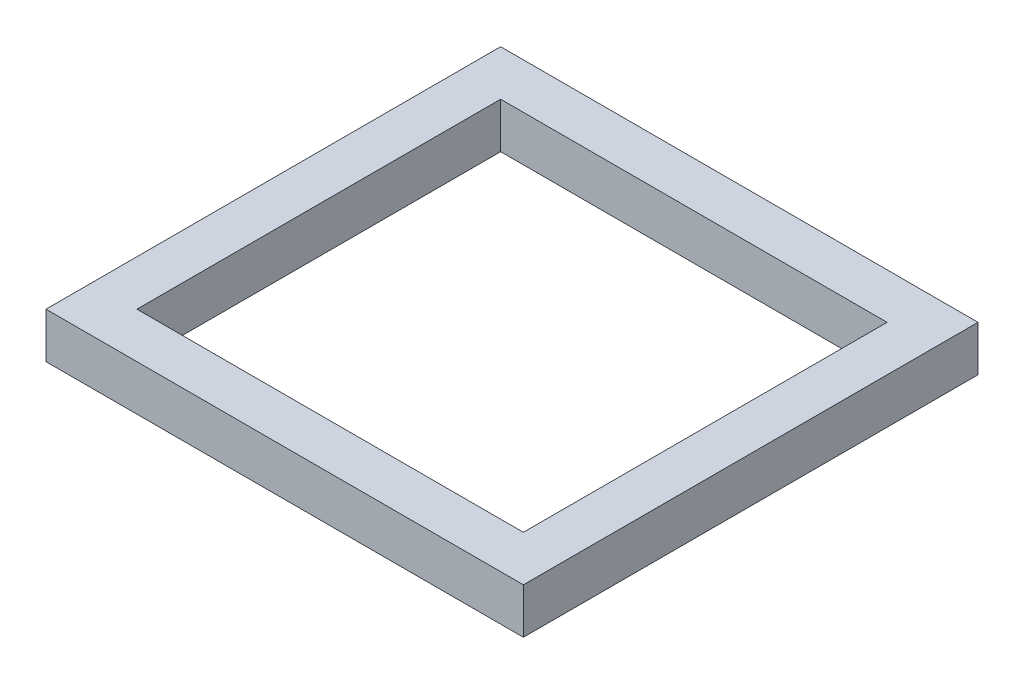
ISO-10303-21;
HEADER;
FILE_DESCRIPTION(('STEP AP214'),'2;1');
FILE_NAME('part.step','',(''),(''),'','','');
FILE_SCHEMA(('AUTOMOTIVE_DESIGN { 1 0 10303 214 1 1 1 1 }'));
ENDSEC;
DATA;
#1=APPLICATION_CONTEXT('core data for automotive mechanical design processes');
#2=APPLICATION_PROTOCOL_DEFINITION('international standard','automotive_design',2000,#1);
#3=PRODUCT_CONTEXT('',#1,'mechanical');
#4=PRODUCT('Part','Part','',(#3));
#5=PRODUCT_RELATED_PRODUCT_CATEGORY('part','',(#4));
#6=PRODUCT_DEFINITION_FORMATION('','',#4);
#7=PRODUCT_DEFINITION_CONTEXT('part definition',#1,'design');
#8=PRODUCT_DEFINITION('design','',#6,#7);
#9=PRODUCT_DEFINITION_SHAPE('','',#8);
#10=(LENGTH_UNIT() NAMED_UNIT(*) SI_UNIT(.MILLI.,.METRE.));
#11=(NAMED_UNIT(*) PLANE_ANGLE_UNIT() SI_UNIT($,.RADIAN.));
#12=(NAMED_UNIT(*) SI_UNIT($,.STERADIAN.) SOLID_ANGLE_UNIT());
#13=UNCERTAINTY_MEASURE_WITH_UNIT(LENGTH_MEASURE(1.E-05),#10,'distance_accuracy_value','');
#14=(GEOMETRIC_REPRESENTATION_CONTEXT(3) GLOBAL_UNCERTAINTY_ASSIGNED_CONTEXT((#13)) GLOBAL_UNIT_ASSIGNED_CONTEXT((#10,
#11,#12)) REPRESENTATION_CONTEXT('',''));
#15=CARTESIAN_POINT('',(0.,0.,0.));
#16=DIRECTION('',(0.,0.,1.));
#17=DIRECTION('',(1.,0.,0.));
#18=AXIS2_PLACEMENT_3D('',#15,#16,#17);
#19=CARTESIAN_POINT('',(0.,25.4,0.));
#20=DIRECTION('',(0.,-1.,0.));
#21=DIRECTION('',(0.,0.,-1.));
#22=AXIS2_PLACEMENT_3D('',#19,#20,#21);
#23=PLANE('',#22);
#24=DIRECTION('',(0.,0.,-1.));
#25=VECTOR('',#24,1.);
#26=CARTESIAN_POINT('',(133.35,25.4,127.));
#27=LINE('',#26,#25);
#28=CARTESIAN_POINT('',(133.35,25.4,127.));
#29=VERTEX_POINT('',#28);
#30=CARTESIAN_POINT('',(133.35,25.4,-127.));
#31=VERTEX_POINT('',#30);
#32=EDGE_CURVE('E134',#29,#31,#27,.T.);
#33=ORIENTED_EDGE('',*,*,#32,.T.);
#34=DIRECTION('',(-1.,0.,0.));
#35=VECTOR('',#34,1.);
#36=CARTESIAN_POINT('',(-133.35,25.4,-127.));
#37=LINE('',#36,#35);
#38=CARTESIAN_POINT('',(-133.35,25.4,-127.));
#39=VERTEX_POINT('',#38);
#40=EDGE_CURVE('E137',#31,#39,#37,.T.);
#41=ORIENTED_EDGE('',*,*,#40,.T.);
#42=DIRECTION('',(0.,0.,1.));
#43=VECTOR('',#42,1.);
#44=CARTESIAN_POINT('',(-133.35,25.4,127.));
#45=LINE('',#44,#43);
#46=CARTESIAN_POINT('',(-133.35,25.4,127.));
#47=VERTEX_POINT('',#46);
#48=EDGE_CURVE('E140',#39,#47,#45,.T.);
#49=ORIENTED_EDGE('',*,*,#48,.T.);
#50=DIRECTION('',(1.,0.,0.));
#51=VECTOR('',#50,1.);
#52=CARTESIAN_POINT('',(-133.35,25.4,127.));
#53=LINE('',#52,#51);
#54=EDGE_CURVE('E142',#47,#29,#53,.T.);
#55=ORIENTED_EDGE('',*,*,#54,.T.);
#56=EDGE_LOOP('',(#33,#41,#49,#55));
#57=FACE_BOUND('',#56,.T.);
#58=DIRECTION('',(0.,0.,-1.));
#59=VECTOR('',#58,1.);
#60=CARTESIAN_POINT('',(107.95,25.4,101.6));
#61=LINE('',#60,#59);
#62=CARTESIAN_POINT('',(107.95,25.4,101.6));
#63=VERTEX_POINT('',#62);
#64=CARTESIAN_POINT('',(107.95,25.4,-101.6));
#65=VERTEX_POINT('',#64);
#66=EDGE_CURVE('E98',#63,#65,#61,.T.);
#67=ORIENTED_EDGE('',*,*,#66,.F.);
#68=DIRECTION('',(1.,0.,0.));
#69=VECTOR('',#68,1.);
#70=CARTESIAN_POINT('',(-107.95,25.4,101.6));
#71=LINE('',#70,#69);
#72=CARTESIAN_POINT('',(-107.95,25.4,101.6));
#73=VERTEX_POINT('',#72);
#74=EDGE_CURVE('E120',#73,#63,#71,.T.);
#75=ORIENTED_EDGE('',*,*,#74,.F.);
#76=DIRECTION('',(0.,0.,1.));
#77=VECTOR('',#76,1.);
#78=CARTESIAN_POINT('',(-107.95,25.4,101.6));
#79=LINE('',#78,#77);
#80=CARTESIAN_POINT('',(-107.95,25.4,-101.6));
#81=VERTEX_POINT('',#80);
#82=EDGE_CURVE('E118',#81,#73,#79,.T.);
#83=ORIENTED_EDGE('',*,*,#82,.F.);
#84=DIRECTION('',(-1.,0.,0.));
#85=VECTOR('',#84,1.);
#86=CARTESIAN_POINT('',(-107.95,25.4,-101.6));
#87=LINE('',#86,#85);
#88=EDGE_CURVE('E106',#65,#81,#87,.T.);
#89=ORIENTED_EDGE('',*,*,#88,.F.);
#90=EDGE_LOOP('',(#67,#75,#83,#89));
#91=FACE_BOUND('',#90,.T.);
#92=ADVANCED_FACE('F33',(#57,#91),#23,.F.);
#93=CARTESIAN_POINT('',(0.,0.,0.));
#94=DIRECTION('',(0.,-1.,0.));
#95=DIRECTION('',(0.,0.,-1.));
#96=AXIS2_PLACEMENT_3D('',#93,#94,#95);
#97=PLANE('',#96);
#98=DIRECTION('',(0.,0.,-1.));
#99=VECTOR('',#98,1.);
#100=CARTESIAN_POINT('',(133.35,0.,127.));
#101=LINE('',#100,#99);
#102=CARTESIAN_POINT('',(133.35,0.,127.));
#103=VERTEX_POINT('',#102);
#104=CARTESIAN_POINT('',(133.35,0.,-127.));
#105=VERTEX_POINT('',#104);
#106=EDGE_CURVE('E114',#103,#105,#101,.T.);
#107=ORIENTED_EDGE('',*,*,#106,.F.);
#108=DIRECTION('',(1.,0.,0.));
#109=VECTOR('',#108,1.);
#110=CARTESIAN_POINT('',(-133.35,0.,127.));
#111=LINE('',#110,#109);
#112=CARTESIAN_POINT('',(-133.35,0.,127.));
#113=VERTEX_POINT('',#112);
#114=EDGE_CURVE('E138',#113,#103,#111,.T.);
#115=ORIENTED_EDGE('',*,*,#114,.F.);
#116=DIRECTION('',(0.,0.,1.));
#117=VECTOR('',#116,1.);
#118=CARTESIAN_POINT('',(-133.35,0.,127.));
#119=LINE('',#118,#117);
#120=CARTESIAN_POINT('',(-133.35,0.,-127.));
#121=VERTEX_POINT('',#120);
#122=EDGE_CURVE('E149',#121,#113,#119,.T.);
#123=ORIENTED_EDGE('',*,*,#122,.F.);
#124=DIRECTION('',(-1.,0.,0.));
#125=VECTOR('',#124,1.);
#126=CARTESIAN_POINT('',(-133.35,0.,-127.));
#127=LINE('',#126,#125);
#128=EDGE_CURVE('E147',#105,#121,#127,.T.);
#129=ORIENTED_EDGE('',*,*,#128,.F.);
#130=EDGE_LOOP('',(#107,#115,#123,#129));
#131=FACE_BOUND('',#130,.T.);
#132=DIRECTION('',(1.,0.,0.));
#133=VECTOR('',#132,1.);
#134=CARTESIAN_POINT('',(-107.95,0.,101.6));
#135=LINE('',#134,#133);
#136=CARTESIAN_POINT('',(-107.95,0.,101.6));
#137=VERTEX_POINT('',#136);
#138=CARTESIAN_POINT('',(107.95,0.,101.6));
#139=VERTEX_POINT('',#138);
#140=EDGE_CURVE('E107',#137,#139,#135,.T.);
#141=ORIENTED_EDGE('',*,*,#140,.T.);
#142=DIRECTION('',(0.,0.,-1.));
#143=VECTOR('',#142,1.);
#144=CARTESIAN_POINT('',(107.95,0.,101.6));
#145=LINE('',#144,#143);
#146=CARTESIAN_POINT('',(107.95,0.,-101.6));
#147=VERTEX_POINT('',#146);
#148=EDGE_CURVE('E56',#139,#147,#145,.T.);
#149=ORIENTED_EDGE('',*,*,#148,.T.);
#150=DIRECTION('',(-1.,0.,0.));
#151=VECTOR('',#150,1.);
#152=CARTESIAN_POINT('',(-107.95,0.,-101.6));
#153=LINE('',#152,#151);
#154=CARTESIAN_POINT('',(-107.95,0.,-101.6));
#155=VERTEX_POINT('',#154);
#156=EDGE_CURVE('E113',#147,#155,#153,.T.);
#157=ORIENTED_EDGE('',*,*,#156,.T.);
#158=DIRECTION('',(0.,0.,1.));
#159=VECTOR('',#158,1.);
#160=CARTESIAN_POINT('',(-107.95,0.,101.6));
#161=LINE('',#160,#159);
#162=EDGE_CURVE('E126',#155,#137,#161,.T.);
#163=ORIENTED_EDGE('',*,*,#162,.T.);
#164=EDGE_LOOP('',(#141,#149,#157,#163));
#165=FACE_BOUND('',#164,.T.);
#166=ADVANCED_FACE('F167',(#131,#165),#97,.T.);
#167=CARTESIAN_POINT('',(133.35,25.4,127.));
#168=DIRECTION('',(-1.,0.,0.));
#169=DIRECTION('',(0.,0.,1.));
#170=AXIS2_PLACEMENT_3D('',#167,#168,#169);
#171=PLANE('',#170);
#172=ORIENTED_EDGE('',*,*,#106,.T.);
#173=DIRECTION('',(0.,-1.,0.));
#174=VECTOR('',#173,1.);
#175=CARTESIAN_POINT('',(133.35,25.4,-127.));
#176=LINE('',#175,#174);
#177=EDGE_CURVE('E11',#31,#105,#176,.T.);
#178=ORIENTED_EDGE('',*,*,#177,.F.);
#179=ORIENTED_EDGE('',*,*,#32,.F.);
#180=DIRECTION('',(0.,-1.,0.));
#181=VECTOR('',#180,1.);
#182=CARTESIAN_POINT('',(133.35,25.4,127.));
#183=LINE('',#182,#181);
#184=EDGE_CURVE('E144',#29,#103,#183,.T.);
#185=ORIENTED_EDGE('',*,*,#184,.T.);
#186=EDGE_LOOP('',(#172,#178,#179,#185));
#187=FACE_BOUND('',#186,.T.);
#188=ADVANCED_FACE('F35',(#187),#171,.F.);
#189=CARTESIAN_POINT('',(-133.35,25.4,-127.));
#190=DIRECTION('',(0.,0.,1.));
#191=DIRECTION('',(1.,0.,0.));
#192=AXIS2_PLACEMENT_3D('',#189,#190,#191);
#193=PLANE('',#192);
#194=ORIENTED_EDGE('',*,*,#128,.T.);
#195=DIRECTION('',(0.,-1.,0.));
#196=VECTOR('',#195,1.);
#197=CARTESIAN_POINT('',(-133.35,25.4,-127.));
#198=LINE('',#197,#196);
#199=EDGE_CURVE('E41',#39,#121,#198,.T.);
#200=ORIENTED_EDGE('',*,*,#199,.F.);
#201=ORIENTED_EDGE('',*,*,#40,.F.);
#202=ORIENTED_EDGE('',*,*,#177,.T.);
#203=EDGE_LOOP('',(#194,#200,#201,#202));
#204=FACE_BOUND('',#203,.T.);
#205=ADVANCED_FACE('F177',(#204),#193,.F.);
#206=CARTESIAN_POINT('',(-133.35,25.4,127.));
#207=DIRECTION('',(1.,0.,0.));
#208=DIRECTION('',(0.,0.,-1.));
#209=AXIS2_PLACEMENT_3D('',#206,#207,#208);
#210=PLANE('',#209);
#211=ORIENTED_EDGE('',*,*,#122,.T.);
#212=DIRECTION('',(0.,-1.,0.));
#213=VECTOR('',#212,1.);
#214=CARTESIAN_POINT('',(-133.35,25.4,127.));
#215=LINE('',#214,#213);
#216=EDGE_CURVE('E154',#47,#113,#215,.T.);
#217=ORIENTED_EDGE('',*,*,#216,.F.);
#218=ORIENTED_EDGE('',*,*,#48,.F.);
#219=ORIENTED_EDGE('',*,*,#199,.T.);
#220=EDGE_LOOP('',(#211,#217,#218,#219));
#221=FACE_BOUND('',#220,.T.);
#222=ADVANCED_FACE('F161',(#221),#210,.F.);
#223=CARTESIAN_POINT('',(-133.35,25.4,127.));
#224=DIRECTION('',(0.,0.,-1.));
#225=DIRECTION('',(-1.,0.,0.));
#226=AXIS2_PLACEMENT_3D('',#223,#224,#225);
#227=PLANE('',#226);
#228=ORIENTED_EDGE('',*,*,#114,.T.);
#229=ORIENTED_EDGE('',*,*,#184,.F.);
#230=ORIENTED_EDGE('',*,*,#54,.F.);
#231=ORIENTED_EDGE('',*,*,#216,.T.);
#232=EDGE_LOOP('',(#228,#229,#230,#231));
#233=FACE_BOUND('',#232,.T.);
#234=ADVANCED_FACE('F171',(#233),#227,.F.);
#235=CARTESIAN_POINT('',(107.95,25.4,101.6));
#236=DIRECTION('',(-1.,0.,0.));
#237=DIRECTION('',(0.,0.,1.));
#238=AXIS2_PLACEMENT_3D('',#235,#236,#237);
#239=PLANE('',#238);
#240=ORIENTED_EDGE('',*,*,#148,.F.);
#241=DIRECTION('',(0.,-1.,0.));
#242=VECTOR('',#241,1.);
#243=CARTESIAN_POINT('',(107.95,25.4,101.6));
#244=LINE('',#243,#242);
#245=EDGE_CURVE('E102',#63,#139,#244,.T.);
#246=ORIENTED_EDGE('',*,*,#245,.F.);
#247=ORIENTED_EDGE('',*,*,#66,.T.);
#248=DIRECTION('',(0.,-1.,0.));
#249=VECTOR('',#248,1.);
#250=CARTESIAN_POINT('',(107.95,25.4,-101.6));
#251=LINE('',#250,#249);
#252=EDGE_CURVE('E101',#65,#147,#251,.T.);
#253=ORIENTED_EDGE('',*,*,#252,.T.);
#254=EDGE_LOOP('',(#240,#246,#247,#253));
#255=FACE_BOUND('',#254,.T.);
#256=ADVANCED_FACE('F100',(#255),#239,.T.);
#257=CARTESIAN_POINT('',(-107.95,25.4,-101.6));
#258=DIRECTION('',(0.,0.,1.));
#259=DIRECTION('',(1.,0.,0.));
#260=AXIS2_PLACEMENT_3D('',#257,#258,#259);
#261=PLANE('',#260);
#262=ORIENTED_EDGE('',*,*,#156,.F.);
#263=ORIENTED_EDGE('',*,*,#252,.F.);
#264=ORIENTED_EDGE('',*,*,#88,.T.);
#265=DIRECTION('',(0.,-1.,0.));
#266=VECTOR('',#265,1.);
#267=CARTESIAN_POINT('',(-107.95,25.4,-101.6));
#268=LINE('',#267,#266);
#269=EDGE_CURVE('E115',#81,#155,#268,.T.);
#270=ORIENTED_EDGE('',*,*,#269,.T.);
#271=EDGE_LOOP('',(#262,#263,#264,#270));
#272=FACE_BOUND('',#271,.T.);
#273=ADVANCED_FACE('F110',(#272),#261,.T.);
#274=CARTESIAN_POINT('',(-107.95,25.4,101.6));
#275=DIRECTION('',(1.,0.,0.));
#276=DIRECTION('',(0.,0.,-1.));
#277=AXIS2_PLACEMENT_3D('',#274,#275,#276);
#278=PLANE('',#277);
#279=ORIENTED_EDGE('',*,*,#162,.F.);
#280=ORIENTED_EDGE('',*,*,#269,.F.);
#281=ORIENTED_EDGE('',*,*,#82,.T.);
#282=DIRECTION('',(0.,-1.,0.));
#283=VECTOR('',#282,1.);
#284=CARTESIAN_POINT('',(-107.95,25.4,101.6));
#285=LINE('',#284,#283);
#286=EDGE_CURVE('E48',#73,#137,#285,.T.);
#287=ORIENTED_EDGE('',*,*,#286,.T.);
#288=EDGE_LOOP('',(#279,#280,#281,#287));
#289=FACE_BOUND('',#288,.T.);
#290=ADVANCED_FACE('F200',(#289),#278,.T.);
#291=CARTESIAN_POINT('',(-107.95,25.4,101.6));
#292=DIRECTION('',(0.,0.,-1.));
#293=DIRECTION('',(-1.,0.,0.));
#294=AXIS2_PLACEMENT_3D('',#291,#292,#293);
#295=PLANE('',#294);
#296=ORIENTED_EDGE('',*,*,#140,.F.);
#297=ORIENTED_EDGE('',*,*,#286,.F.);
#298=ORIENTED_EDGE('',*,*,#74,.T.);
#299=ORIENTED_EDGE('',*,*,#245,.T.);
#300=EDGE_LOOP('',(#296,#297,#298,#299));
#301=FACE_BOUND('',#300,.T.);
#302=ADVANCED_FACE('F204',(#301),#295,.T.);
#303=CLOSED_SHELL('',(#92,#166,#188,#205,#222,#234,#256,#273,#290,#302));
#304=MANIFOLD_SOLID_BREP('B2',#303);
#305=ADVANCED_BREP_SHAPE_REPRESENTATION('',(#18,#304),#14);
#306=SHAPE_DEFINITION_REPRESENTATION(#9,#305);
ENDSEC;
END-ISO-10303-21;
